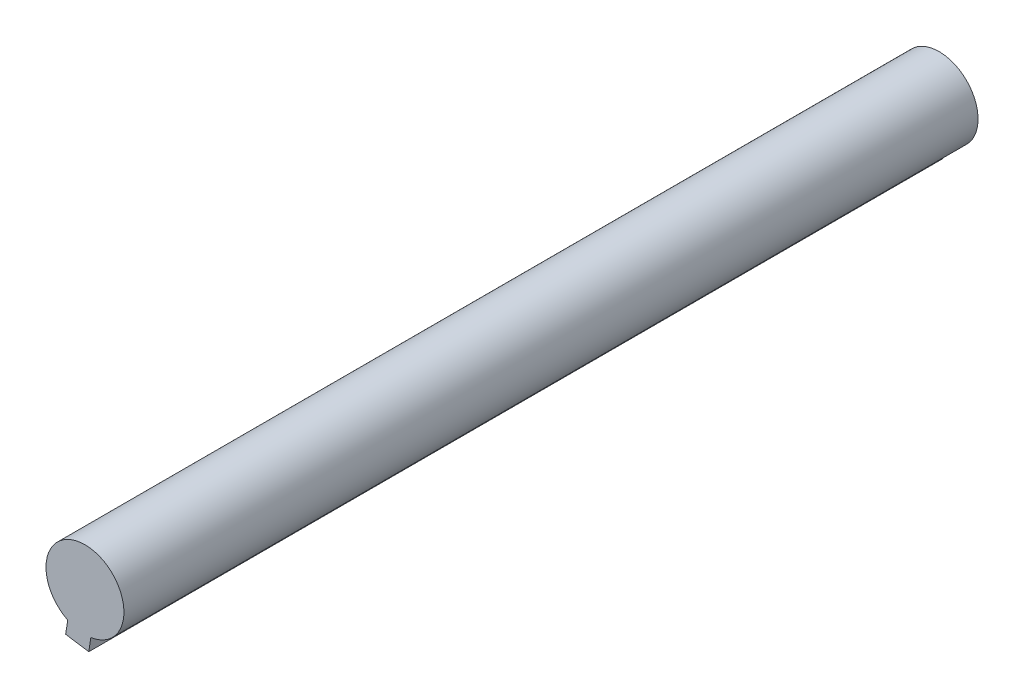
ISO-10303-21;
HEADER;
FILE_DESCRIPTION(('STEP AP214'),'2;1');
FILE_NAME('part.step','',(''),(''),'','','');
FILE_SCHEMA(('AUTOMOTIVE_DESIGN { 1 0 10303 214 1 1 1 1 }'));
ENDSEC;
DATA;
#1=APPLICATION_CONTEXT('core data for automotive mechanical design processes');
#2=APPLICATION_PROTOCOL_DEFINITION('international standard','automotive_design',2000,#1);
#3=PRODUCT_CONTEXT('',#1,'mechanical');
#4=PRODUCT('Part','Part','',(#3));
#5=PRODUCT_RELATED_PRODUCT_CATEGORY('part','',(#4));
#6=PRODUCT_DEFINITION_FORMATION('','',#4);
#7=PRODUCT_DEFINITION_CONTEXT('part definition',#1,'design');
#8=PRODUCT_DEFINITION('design','',#6,#7);
#9=PRODUCT_DEFINITION_SHAPE('','',#8);
#10=(LENGTH_UNIT() NAMED_UNIT(*) SI_UNIT(.MILLI.,.METRE.));
#11=(NAMED_UNIT(*) PLANE_ANGLE_UNIT() SI_UNIT($,.RADIAN.));
#12=(NAMED_UNIT(*) SI_UNIT($,.STERADIAN.) SOLID_ANGLE_UNIT());
#13=UNCERTAINTY_MEASURE_WITH_UNIT(LENGTH_MEASURE(1.E-05),#10,'distance_accuracy_value','');
#14=(GEOMETRIC_REPRESENTATION_CONTEXT(3) GLOBAL_UNCERTAINTY_ASSIGNED_CONTEXT((#13)) GLOBAL_UNIT_ASSIGNED_CONTEXT((#10,
#11,#12)) REPRESENTATION_CONTEXT('',''));
#15=CARTESIAN_POINT('',(0.,0.,0.));
#16=DIRECTION('',(0.,0.,1.));
#17=DIRECTION('',(1.,0.,0.));
#18=AXIS2_PLACEMENT_3D('',#15,#16,#17);
#19=CARTESIAN_POINT('',(0.,0.,173.99));
#20=DIRECTION('',(0.,0.,-1.));
#21=DIRECTION('',(-1.,0.,0.));
#22=AXIS2_PLACEMENT_3D('',#19,#20,#21);
#23=CYLINDRICAL_SURFACE('',#22,7.93750000000023);
#24=CARTESIAN_POINT('',(0.,0.,0.));
#25=DIRECTION('',(0.,0.,1.));
#26=DIRECTION('',(1.,0.,0.));
#27=AXIS2_PLACEMENT_3D('',#24,#25,#26);
#28=CIRCLE('',#27,7.93750000000023);
#29=CARTESIAN_POINT('',(1.19410276425589,-7.84716667583888,0.));
#30=VERTEX_POINT('',#29);
#31=CARTESIAN_POINT('',(-3.5122676805915,-7.1181375365948,0.));
#32=VERTEX_POINT('',#31);
#33=EDGE_CURVE('E115',#30,#32,#28,.T.);
#34=ORIENTED_EDGE('',*,*,#33,.T.);
#35=DIRECTION('',(0.,0.,-1.));
#36=VECTOR('',#35,1.);
#37=CARTESIAN_POINT('',(-3.5122676805915,-7.1181375365948,173.99));
#38=LINE('',#37,#36);
#39=CARTESIAN_POINT('',(-3.5122676805915,-7.1181375365948,173.99));
#40=VERTEX_POINT('',#39);
#41=EDGE_CURVE('E11',#40,#32,#38,.T.);
#42=ORIENTED_EDGE('',*,*,#41,.F.);
#43=CARTESIAN_POINT('',(0.,0.,173.99));
#44=DIRECTION('',(0.,0.,1.));
#45=DIRECTION('',(1.,0.,0.));
#46=AXIS2_PLACEMENT_3D('',#43,#44,#45);
#47=CIRCLE('',#46,7.93750000000023);
#48=CARTESIAN_POINT('',(1.19410276425589,-7.84716667583888,173.99));
#49=VERTEX_POINT('',#48);
#50=EDGE_CURVE('E99',#49,#40,#47,.T.);
#51=ORIENTED_EDGE('',*,*,#50,.F.);
#52=DIRECTION('',(0.,0.,-1.));
#53=VECTOR('',#52,1.);
#54=CARTESIAN_POINT('',(1.19410276425589,-7.84716667583888,173.99));
#55=LINE('',#54,#53);
#56=EDGE_CURVE('E111',#49,#30,#55,.T.);
#57=ORIENTED_EDGE('',*,*,#56,.T.);
#58=EDGE_LOOP('',(#34,#42,#51,#57));
#59=FACE_BOUND('',#58,.T.);
#60=ADVANCED_FACE('F39',(#59),#23,.T.);
#61=CARTESIAN_POINT('',(-3.5122676805915,-7.1181375365948,173.99));
#62=DIRECTION('',(0.988214266634623,-0.15307698461818,0.));
#63=DIRECTION('',(0.15307698461818,0.988214266634623,0.));
#64=AXIS2_PLACEMENT_3D('',#61,#62,#63);
#65=PLANE('',#64);
#66=DIRECTION('',(-0.15307698461818,-0.988214266634623,0.));
#67=VECTOR('',#66,1.);
#68=CARTESIAN_POINT('',(-3.5122676805915,-7.1181375365948,0.));
#69=LINE('',#68,#67);
#70=CARTESIAN_POINT('',(-3.93274835745337,-9.83262139421408,0.));
#71=VERTEX_POINT('',#70);
#72=EDGE_CURVE('E104',#32,#71,#69,.T.);
#73=ORIENTED_EDGE('',*,*,#72,.T.);
#74=DIRECTION('',(0.,0.,-1.));
#75=VECTOR('',#74,1.);
#76=CARTESIAN_POINT('',(-3.93274835745337,-9.83262139421408,173.99));
#77=LINE('',#76,#75);
#78=CARTESIAN_POINT('',(-3.93274835745337,-9.83262139421408,173.99));
#79=VERTEX_POINT('',#78);
#80=EDGE_CURVE('E48',#79,#71,#77,.T.);
#81=ORIENTED_EDGE('',*,*,#80,.F.);
#82=DIRECTION('',(-0.15307698461818,-0.988214266634623,0.));
#83=VECTOR('',#82,1.);
#84=CARTESIAN_POINT('',(-3.5122676805915,-7.1181375365948,173.99));
#85=LINE('',#84,#83);
#86=EDGE_CURVE('E94',#40,#79,#85,.T.);
#87=ORIENTED_EDGE('',*,*,#86,.F.);
#88=ORIENTED_EDGE('',*,*,#41,.T.);
#89=EDGE_LOOP('',(#73,#81,#87,#88));
#90=FACE_BOUND('',#89,.T.);
#91=ADVANCED_FACE('F103',(#90),#65,.F.);
#92=CARTESIAN_POINT('',(-3.93274835745337,-9.83262139421408,173.99));
#93=DIRECTION('',(0.15307698461818,0.988214266634623,0.));
#94=DIRECTION('',(-0.988214266634623,0.15307698461818,0.));
#95=AXIS2_PLACEMENT_3D('',#92,#93,#94);
#96=PLANE('',#95);
#97=DIRECTION('',(0.988214266634623,-0.15307698461818,0.));
#98=VECTOR('',#97,1.);
#99=CARTESIAN_POINT('',(-3.93274835745337,-9.83262139421408,0.));
#100=LINE('',#99,#98);
#101=CARTESIAN_POINT('',(0.773622087394022,-10.5616505334582,0.));
#102=VERTEX_POINT('',#101);
#103=EDGE_CURVE('E79',#71,#102,#100,.T.);
#104=ORIENTED_EDGE('',*,*,#103,.T.);
#105=DIRECTION('',(0.,0.,-1.));
#106=VECTOR('',#105,1.);
#107=CARTESIAN_POINT('',(0.773622087394022,-10.5616505334582,173.99));
#108=LINE('',#107,#106);
#109=CARTESIAN_POINT('',(0.773622087394022,-10.5616505334582,173.99));
#110=VERTEX_POINT('',#109);
#111=EDGE_CURVE('E106',#110,#102,#108,.T.);
#112=ORIENTED_EDGE('',*,*,#111,.F.);
#113=DIRECTION('',(0.988214266634623,-0.15307698461818,0.));
#114=VECTOR('',#113,1.);
#115=CARTESIAN_POINT('',(-3.93274835745337,-9.83262139421408,173.99));
#116=LINE('',#115,#114);
#117=EDGE_CURVE('E97',#79,#110,#116,.T.);
#118=ORIENTED_EDGE('',*,*,#117,.F.);
#119=ORIENTED_EDGE('',*,*,#80,.T.);
#120=EDGE_LOOP('',(#104,#112,#118,#119));
#121=FACE_BOUND('',#120,.T.);
#122=ADVANCED_FACE('F107',(#121),#96,.F.);
#123=CARTESIAN_POINT('',(0.773622087394022,-10.5616505334582,173.99));
#124=DIRECTION('',(-0.988214266634623,0.153076984618179,0.));
#125=DIRECTION('',(-0.153076984618179,-0.988214266634623,0.));
#126=AXIS2_PLACEMENT_3D('',#123,#124,#125);
#127=PLANE('',#126);
#128=DIRECTION('',(0.153076984618179,0.988214266634623,0.));
#129=VECTOR('',#128,1.);
#130=CARTESIAN_POINT('',(0.773622087394022,-10.5616505334582,0.));
#131=LINE('',#130,#129);
#132=EDGE_CURVE('E85',#102,#30,#131,.T.);
#133=ORIENTED_EDGE('',*,*,#132,.T.);
#134=ORIENTED_EDGE('',*,*,#56,.F.);
#135=DIRECTION('',(0.153076984618179,0.988214266634623,0.));
#136=VECTOR('',#135,1.);
#137=CARTESIAN_POINT('',(0.773622087394022,-10.5616505334582,173.99));
#138=LINE('',#137,#136);
#139=EDGE_CURVE('E59',#110,#49,#138,.T.);
#140=ORIENTED_EDGE('',*,*,#139,.F.);
#141=ORIENTED_EDGE('',*,*,#111,.T.);
#142=EDGE_LOOP('',(#133,#134,#140,#141));
#143=FACE_BOUND('',#142,.T.);
#144=ADVANCED_FACE('F128',(#143),#127,.F.);
#145=CARTESIAN_POINT('',(0.,0.,173.99));
#146=DIRECTION('',(0.,0.,1.));
#147=DIRECTION('',(1.,0.,0.));
#148=AXIS2_PLACEMENT_3D('',#145,#146,#147);
#149=PLANE('',#148);
#150=ORIENTED_EDGE('',*,*,#50,.T.);
#151=ORIENTED_EDGE('',*,*,#86,.T.);
#152=ORIENTED_EDGE('',*,*,#117,.T.);
#153=ORIENTED_EDGE('',*,*,#139,.T.);
#154=EDGE_LOOP('',(#150,#151,#152,#153));
#155=FACE_BOUND('',#154,.T.);
#156=ADVANCED_FACE('F95',(#155),#149,.T.);
#157=CARTESIAN_POINT('',(0.,0.,0.));
#158=DIRECTION('',(0.,0.,1.));
#159=DIRECTION('',(1.,0.,0.));
#160=AXIS2_PLACEMENT_3D('',#157,#158,#159);
#161=PLANE('',#160);
#162=ORIENTED_EDGE('',*,*,#33,.F.);
#163=ORIENTED_EDGE('',*,*,#132,.F.);
#164=ORIENTED_EDGE('',*,*,#103,.F.);
#165=ORIENTED_EDGE('',*,*,#72,.F.);
#166=EDGE_LOOP('',(#162,#163,#164,#165));
#167=FACE_BOUND('',#166,.T.);
#168=ADVANCED_FACE('F131',(#167),#161,.F.);
#169=CLOSED_SHELL('',(#60,#91,#122,#144,#156,#168));
#170=MANIFOLD_SOLID_BREP('B2',#169);
#171=ADVANCED_BREP_SHAPE_REPRESENTATION('',(#18,#170),#14);
#172=SHAPE_DEFINITION_REPRESENTATION(#9,#171);
ENDSEC;
END-ISO-10303-21;
